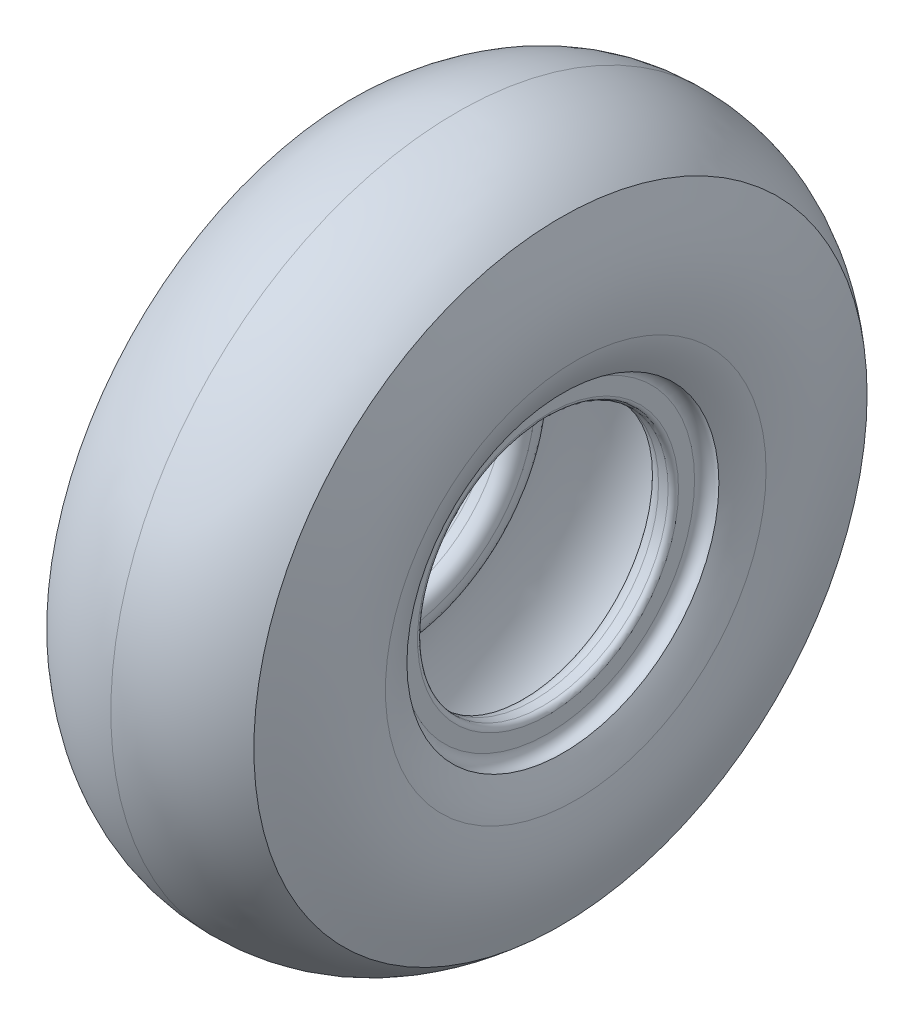
ISO-10303-21;
HEADER;
FILE_DESCRIPTION(('STEP AP214'),'2;1');
FILE_NAME('part.step','',(''),(''),'','','');
FILE_SCHEMA(('AUTOMOTIVE_DESIGN { 1 0 10303 214 1 1 1 1 }'));
ENDSEC;
DATA;
#1=APPLICATION_CONTEXT('core data for automotive mechanical design processes');
#2=APPLICATION_PROTOCOL_DEFINITION('international standard','automotive_design',2000,#1);
#3=PRODUCT_CONTEXT('',#1,'mechanical');
#4=PRODUCT('Part','Part','',(#3));
#5=PRODUCT_RELATED_PRODUCT_CATEGORY('part','',(#4));
#6=PRODUCT_DEFINITION_FORMATION('','',#4);
#7=PRODUCT_DEFINITION_CONTEXT('part definition',#1,'design');
#8=PRODUCT_DEFINITION('design','',#6,#7);
#9=PRODUCT_DEFINITION_SHAPE('','',#8);
#10=(LENGTH_UNIT() NAMED_UNIT(*) SI_UNIT(.MILLI.,.METRE.));
#11=(NAMED_UNIT(*) PLANE_ANGLE_UNIT() SI_UNIT($,.RADIAN.));
#12=(NAMED_UNIT(*) SI_UNIT($,.STERADIAN.) SOLID_ANGLE_UNIT());
#13=UNCERTAINTY_MEASURE_WITH_UNIT(LENGTH_MEASURE(1.E-05),#10,'distance_accuracy_value','');
#14=(GEOMETRIC_REPRESENTATION_CONTEXT(3) GLOBAL_UNCERTAINTY_ASSIGNED_CONTEXT((#13)) GLOBAL_UNIT_ASSIGNED_CONTEXT((#10,
#11,#12)) REPRESENTATION_CONTEXT('',''));
#15=CARTESIAN_POINT('',(0.,0.,0.));
#16=DIRECTION('',(0.,0.,1.));
#17=DIRECTION('',(1.,0.,0.));
#18=AXIS2_PLACEMENT_3D('',#15,#16,#17);
#19=CARTESIAN_POINT('',(-126.,373.,0.));
#20=CARTESIAN_POINT('',(-134.463972669788,346.616375838066,0.));
#21=CARTESIAN_POINT('',(-150.849086538786,300.261707780423,0.));
#22=CARTESIAN_POINT('',(-147.808915286661,251.408445959692,0.));
#23=CARTESIAN_POINT('',(-144.553912722823,231.528887517126,0.));
#24=B_SPLINE_CURVE_WITH_KNOTS('',3,(#19,#20,#21,#22,#23),.UNSPECIFIED.,.F.,.F.,(4,1,4),(0.,
0.58160163982579,1.),.UNSPECIFIED.);
#25=CARTESIAN_POINT('',(0.,0.,0.));
#26=DIRECTION('',(1.,0.,0.));
#27=AXIS1_PLACEMENT('',#25,#26);
#28=SURFACE_OF_REVOLUTION('',#24,#27);
#29=CARTESIAN_POINT('',(-144.553912722823,0.,0.));
#30=DIRECTION('',(1.,0.,0.));
#31=DIRECTION('',(0.,0.,-1.));
#32=AXIS2_PLACEMENT_3D('',#29,#30,#31);
#33=CIRCLE('',#32,231.528887517126);
#34=CARTESIAN_POINT('',(-144.553912722823,0.,-231.528887517126));
#35=VERTEX_POINT('',#34);
#36=EDGE_CURVE('E10',#35,#35,#33,.T.);
#37=ORIENTED_EDGE('',*,*,#36,.T.);
#38=EDGE_LOOP('',(#37));
#39=FACE_BOUND('',#38,.T.);
#40=CARTESIAN_POINT('',(-126.,0.,0.));
#41=DIRECTION('',(1.,0.,0.));
#42=DIRECTION('',(0.,0.,-1.));
#43=AXIS2_PLACEMENT_3D('',#40,#41,#42);
#44=CIRCLE('',#43,373.);
#45=CARTESIAN_POINT('',(-126.,0.,-373.));
#46=VERTEX_POINT('',#45);
#47=EDGE_CURVE('E95',#46,#46,#44,.T.);
#48=ORIENTED_EDGE('',*,*,#47,.F.);
#49=EDGE_LOOP('',(#48));
#50=FACE_BOUND('',#49,.T.);
#51=ADVANCED_FACE('F36',(#39,#50),#28,.F.);
#52=CARTESIAN_POINT('',(-144.553912722823,231.528887517126,0.));
#53=CARTESIAN_POINT('',(-142.116576841013,216.643135461223,0.));
#54=CARTESIAN_POINT('',(-135.993470909118,202.872182939122,0.));
#55=CARTESIAN_POINT('',(-128.926694684957,189.755700946259,0.));
#56=B_SPLINE_CURVE_WITH_KNOTS('',3,(#52,#53,#54,#55),.UNSPECIFIED.,.F.,.F.,(4,4),(0.,1.),.UNSPECIFIED.);
#57=CARTESIAN_POINT('',(0.,0.,0.));
#58=DIRECTION('',(1.,0.,0.));
#59=AXIS1_PLACEMENT('',#57,#58);
#60=SURFACE_OF_REVOLUTION('',#56,#59);
#61=CARTESIAN_POINT('',(-128.926694684957,0.,0.));
#62=DIRECTION('',(1.,0.,0.));
#63=DIRECTION('',(0.,0.,-1.));
#64=AXIS2_PLACEMENT_3D('',#61,#62,#63);
#65=CIRCLE('',#64,189.755700946259);
#66=CARTESIAN_POINT('',(-128.926694684957,0.,-189.755700946259));
#67=VERTEX_POINT('',#66);
#68=EDGE_CURVE('E43',#67,#67,#65,.T.);
#69=ORIENTED_EDGE('',*,*,#68,.T.);
#70=EDGE_LOOP('',(#69));
#71=FACE_BOUND('',#70,.T.);
#72=ORIENTED_EDGE('',*,*,#36,.F.);
#73=EDGE_LOOP('',(#72));
#74=FACE_BOUND('',#73,.T.);
#75=ADVANCED_FACE('F179',(#71,#74),#60,.F.);
#76=CARTESIAN_POINT('',(-123.55,0.,0.));
#77=DIRECTION('',(1.,0.,0.));
#78=DIRECTION('',(0.,0.,-1.));
#79=AXIS2_PLACEMENT_3D('',#76,#77,#78);
#80=TOROIDAL_SURFACE('',#79,178.25,12.7);
#81=CARTESIAN_POINT('',(-110.85,0.,0.));
#82=DIRECTION('',(1.,0.,0.));
#83=DIRECTION('',(0.,0.,-1.));
#84=AXIS2_PLACEMENT_3D('',#81,#82,#83);
#85=CIRCLE('',#84,178.25);
#86=CARTESIAN_POINT('',(-110.85,0.,-178.25));
#87=VERTEX_POINT('',#86);
#88=EDGE_CURVE('E47',#87,#87,#85,.T.);
#89=ORIENTED_EDGE('',*,*,#88,.T.);
#90=EDGE_LOOP('',(#89));
#91=FACE_BOUND('',#90,.T.);
#92=ORIENTED_EDGE('',*,*,#68,.F.);
#93=EDGE_LOOP('',(#92));
#94=FACE_BOUND('',#93,.T.);
#95=ADVANCED_FACE('F176',(#91,#94),#80,.F.);
#96=CARTESIAN_POINT('',(-110.85,178.25,0.));
#97=DIRECTION('',(-1.,0.,0.));
#98=DIRECTION('',(0.,0.,1.));
#99=AXIS2_PLACEMENT_3D('',#96,#97,#98);
#100=PLANE('',#99);
#101=CARTESIAN_POINT('',(-110.85,0.,0.));
#102=DIRECTION('',(1.,0.,0.));
#103=DIRECTION('',(0.,0.,-1.));
#104=AXIS2_PLACEMENT_3D('',#101,#102,#103);
#105=CIRCLE('',#104,158.75);
#106=CARTESIAN_POINT('',(-110.85,0.,-158.75));
#107=VERTEX_POINT('',#106);
#108=EDGE_CURVE('E51',#107,#107,#105,.T.);
#109=ORIENTED_EDGE('',*,*,#108,.T.);
#110=EDGE_LOOP('',(#109));
#111=FACE_BOUND('',#110,.T.);
#112=ORIENTED_EDGE('',*,*,#88,.F.);
#113=EDGE_LOOP('',(#112));
#114=FACE_BOUND('',#113,.T.);
#115=ADVANCED_FACE('F172',(#111,#114),#100,.T.);
#116=CARTESIAN_POINT('',(-104.5,0.,0.));
#117=DIRECTION('',(1.,0.,0.));
#118=DIRECTION('',(0.,0.,-1.));
#119=AXIS2_PLACEMENT_3D('',#116,#117,#118);
#120=TOROIDAL_SURFACE('',#119,158.75,6.35000000000001);
#121=CARTESIAN_POINT('',(-104.5,0.,0.));
#122=DIRECTION('',(1.,0.,0.));
#123=DIRECTION('',(0.,0.,-1.));
#124=AXIS2_PLACEMENT_3D('',#121,#122,#123);
#125=CIRCLE('',#124,152.4);
#126=CARTESIAN_POINT('',(-104.5,0.,-152.4));
#127=VERTEX_POINT('',#126);
#128=EDGE_CURVE('E56',#127,#127,#125,.T.);
#129=ORIENTED_EDGE('',*,*,#128,.T.);
#130=EDGE_LOOP('',(#129));
#131=FACE_BOUND('',#130,.T.);
#132=ORIENTED_EDGE('',*,*,#108,.F.);
#133=EDGE_LOOP('',(#132));
#134=FACE_BOUND('',#133,.T.);
#135=ADVANCED_FACE('F168',(#131,#134),#120,.T.);
#136=CARTESIAN_POINT('',(0.,0.,0.));
#137=DIRECTION('',(1.,0.,0.));
#138=DIRECTION('',(0.,0.,-1.));
#139=AXIS2_PLACEMENT_3D('',#136,#137,#138);
#140=CYLINDRICAL_SURFACE('',#139,152.4);
#141=CARTESIAN_POINT('',(-92.923559226577,0.,0.));
#142=DIRECTION('',(1.,0.,0.));
#143=DIRECTION('',(0.,0.,-1.));
#144=AXIS2_PLACEMENT_3D('',#141,#142,#143);
#145=CIRCLE('',#144,152.4);
#146=CARTESIAN_POINT('',(-92.923559226577,0.,-152.4));
#147=VERTEX_POINT('',#146);
#148=EDGE_CURVE('E59',#147,#147,#145,.T.);
#149=ORIENTED_EDGE('',*,*,#148,.T.);
#150=EDGE_LOOP('',(#149));
#151=FACE_BOUND('',#150,.T.);
#152=ORIENTED_EDGE('',*,*,#128,.F.);
#153=EDGE_LOOP('',(#152));
#154=FACE_BOUND('',#153,.T.);
#155=ADVANCED_FACE('F164',(#151,#154),#140,.F.);
#156=CARTESIAN_POINT('',(-92.923559226577,0.,0.));
#157=DIRECTION('',(1.,0.,0.));
#158=DIRECTION('',(0.,0.,-1.));
#159=AXIS2_PLACEMENT_3D('',#156,#157,#158);
#160=TOROIDAL_SURFACE('',#159,170.326440773423,17.926440773423);
#161=CARTESIAN_POINT('',(-74.997118453154,0.,0.));
#162=DIRECTION('',(1.,0.,0.));
#163=DIRECTION('',(0.,0.,-1.));
#164=AXIS2_PLACEMENT_3D('',#161,#162,#163);
#165=CIRCLE('',#164,170.326440773423);
#166=CARTESIAN_POINT('',(-74.997118453154,0.,-170.326440773423));
#167=VERTEX_POINT('',#166);
#168=EDGE_CURVE('E62',#167,#167,#165,.T.);
#169=ORIENTED_EDGE('',*,*,#168,.T.);
#170=EDGE_LOOP('',(#169));
#171=FACE_BOUND('',#170,.T.);
#172=ORIENTED_EDGE('',*,*,#148,.F.);
#173=EDGE_LOOP('',(#172));
#174=FACE_BOUND('',#173,.T.);
#175=ADVANCED_FACE('F160',(#171,#174),#160,.T.);
#176=CARTESIAN_POINT('',(-74.997118453154,170.326440773423,0.));
#177=CARTESIAN_POINT('',(-74.997118453154,174.893056842313,0.));
#178=CARTESIAN_POINT('',(-75.863137268503,181.894012855497,0.));
#179=CARTESIAN_POINT('',(-82.0328584332981,193.460925903573,0.));
#180=CARTESIAN_POINT('',(-101.647275090504,203.726943462766,0.));
#181=CARTESIAN_POINT('',(-122.603513674661,219.701955533841,0.));
#182=CARTESIAN_POINT('',(-131.843827251993,247.310555364488,0.));
#183=CARTESIAN_POINT('',(-129.946687913005,281.889706084341,0.));
#184=CARTESIAN_POINT('',(-120.331163887066,324.533954003855,0.));
#185=CARTESIAN_POINT('',(-87.243017221231,382.698494330337,0.));
#186=CARTESIAN_POINT('',(-32.66406747827,399.596434141247,0.));
#187=CARTESIAN_POINT('',(0.,401.816012960345,0.));
#188=B_SPLINE_CURVE_WITH_KNOTS('',3,(#176,#177,#178,#179,#180,#181,#182,#183,#184,#185,#186,
#187),.UNSPECIFIED.,.F.,.F.,(4,1,1,1,1,1,1,1,1,4),(0.,0.0343147975041617,0.0496711709441499,
0.153563734399882,0.219661882438087,0.288453449245857,0.408499806443025,0.534394681443801,
0.688488778095142,1.),.UNSPECIFIED.);
#189=CARTESIAN_POINT('',(0.,0.,0.));
#190=DIRECTION('',(1.,0.,0.));
#191=AXIS1_PLACEMENT('',#189,#190);
#192=SURFACE_OF_REVOLUTION('',#188,#191);
#193=CARTESIAN_POINT('',(0.,0.,0.));
#194=DIRECTION('',(1.,0.,0.));
#195=DIRECTION('',(0.,0.,-1.));
#196=AXIS2_PLACEMENT_3D('',#193,#194,#195);
#197=CIRCLE('',#196,401.816012960345);
#198=CARTESIAN_POINT('',(0.,0.,-401.816012960345));
#199=VERTEX_POINT('',#198);
#200=EDGE_CURVE('E65',#199,#199,#197,.T.);
#201=ORIENTED_EDGE('',*,*,#200,.T.);
#202=EDGE_LOOP('',(#201));
#203=FACE_BOUND('',#202,.T.);
#204=ORIENTED_EDGE('',*,*,#168,.F.);
#205=EDGE_LOOP('',(#204));
#206=FACE_BOUND('',#205,.T.);
#207=ADVANCED_FACE('F155',(#203,#206),#192,.F.);
#208=CARTESIAN_POINT('',(0.,401.816012960345,0.));
#209=CARTESIAN_POINT('',(32.66406747827,399.596434141247,0.));
#210=CARTESIAN_POINT('',(87.243017221231,382.698494330337,0.));
#211=CARTESIAN_POINT('',(120.331163887066,324.533954003855,0.));
#212=CARTESIAN_POINT('',(129.946687913005,281.889706084341,0.));
#213=CARTESIAN_POINT('',(131.843827251993,247.310555364488,0.));
#214=CARTESIAN_POINT('',(122.603513674661,219.701955533841,0.));
#215=CARTESIAN_POINT('',(101.647275090504,203.726943462766,0.));
#216=CARTESIAN_POINT('',(82.0328584332981,193.460925903573,0.));
#217=CARTESIAN_POINT('',(75.863137268503,181.894012855497,0.));
#218=CARTESIAN_POINT('',(74.997118453154,174.893056842313,0.));
#219=CARTESIAN_POINT('',(74.997118453154,170.326440773423,0.));
#220=B_SPLINE_CURVE_WITH_KNOTS('',3,(#208,#209,#210,#211,#212,#213,#214,#215,#216,#217,#218,
#219),.UNSPECIFIED.,.F.,.F.,(4,1,1,1,1,1,1,1,1,4),(0.,0.311511221904858,0.465605318556199,
0.591500193556975,0.711546550754143,0.780338117561913,0.846436265600118,0.95032882905585,
0.965685202495838,1.),.UNSPECIFIED.);
#221=CARTESIAN_POINT('',(0.,0.,0.));
#222=DIRECTION('',(1.,0.,0.));
#223=AXIS1_PLACEMENT('',#221,#222);
#224=SURFACE_OF_REVOLUTION('',#220,#223);
#225=CARTESIAN_POINT('',(74.997118453154,0.,0.));
#226=DIRECTION('',(1.,0.,0.));
#227=DIRECTION('',(0.,0.,-1.));
#228=AXIS2_PLACEMENT_3D('',#225,#226,#227);
#229=CIRCLE('',#228,170.326440773423);
#230=CARTESIAN_POINT('',(74.997118453154,0.,-170.326440773423));
#231=VERTEX_POINT('',#230);
#232=EDGE_CURVE('E68',#231,#231,#229,.T.);
#233=ORIENTED_EDGE('',*,*,#232,.T.);
#234=EDGE_LOOP('',(#233));
#235=FACE_BOUND('',#234,.T.);
#236=ORIENTED_EDGE('',*,*,#200,.F.);
#237=EDGE_LOOP('',(#236));
#238=FACE_BOUND('',#237,.T.);
#239=ADVANCED_FACE('F150',(#235,#238),#224,.F.);
#240=CARTESIAN_POINT('',(92.923559226577,0.,0.));
#241=DIRECTION('',(1.,0.,0.));
#242=DIRECTION('',(0.,0.,-1.));
#243=AXIS2_PLACEMENT_3D('',#240,#241,#242);
#244=TOROIDAL_SURFACE('',#243,170.326440773423,17.926440773423);
#245=CARTESIAN_POINT('',(92.923559226577,0.,0.));
#246=DIRECTION('',(1.,0.,0.));
#247=DIRECTION('',(0.,0.,-1.));
#248=AXIS2_PLACEMENT_3D('',#245,#246,#247);
#249=CIRCLE('',#248,152.4);
#250=CARTESIAN_POINT('',(92.923559226577,0.,-152.4));
#251=VERTEX_POINT('',#250);
#252=EDGE_CURVE('E71',#251,#251,#249,.T.);
#253=ORIENTED_EDGE('',*,*,#252,.T.);
#254=EDGE_LOOP('',(#253));
#255=FACE_BOUND('',#254,.T.);
#256=ORIENTED_EDGE('',*,*,#232,.F.);
#257=EDGE_LOOP('',(#256));
#258=FACE_BOUND('',#257,.T.);
#259=ADVANCED_FACE('F154',(#255,#258),#244,.T.);
#260=CARTESIAN_POINT('',(0.,0.,0.));
#261=DIRECTION('',(1.,0.,0.));
#262=DIRECTION('',(0.,0.,-1.));
#263=AXIS2_PLACEMENT_3D('',#260,#261,#262);
#264=CYLINDRICAL_SURFACE('',#263,152.4);
#265=CARTESIAN_POINT('',(104.5,0.,0.));
#266=DIRECTION('',(1.,0.,0.));
#267=DIRECTION('',(0.,0.,-1.));
#268=AXIS2_PLACEMENT_3D('',#265,#266,#267);
#269=CIRCLE('',#268,152.4);
#270=CARTESIAN_POINT('',(104.5,0.,-152.4));
#271=VERTEX_POINT('',#270);
#272=EDGE_CURVE('E74',#271,#271,#269,.T.);
#273=ORIENTED_EDGE('',*,*,#272,.T.);
#274=EDGE_LOOP('',(#273));
#275=FACE_BOUND('',#274,.T.);
#276=ORIENTED_EDGE('',*,*,#252,.F.);
#277=EDGE_LOOP('',(#276));
#278=FACE_BOUND('',#277,.T.);
#279=ADVANCED_FACE('F227',(#275,#278),#264,.F.);
#280=CARTESIAN_POINT('',(104.5,0.,0.));
#281=DIRECTION('',(1.,0.,0.));
#282=DIRECTION('',(0.,0.,-1.));
#283=AXIS2_PLACEMENT_3D('',#280,#281,#282);
#284=TOROIDAL_SURFACE('',#283,158.75,6.35000000000001);
#285=CARTESIAN_POINT('',(110.85,0.,0.));
#286=DIRECTION('',(1.,0.,0.));
#287=DIRECTION('',(0.,0.,-1.));
#288=AXIS2_PLACEMENT_3D('',#285,#286,#287);
#289=CIRCLE('',#288,158.75);
#290=CARTESIAN_POINT('',(110.85,0.,-158.75));
#291=VERTEX_POINT('',#290);
#292=EDGE_CURVE('E77',#291,#291,#289,.T.);
#293=ORIENTED_EDGE('',*,*,#292,.T.);
#294=EDGE_LOOP('',(#293));
#295=FACE_BOUND('',#294,.T.);
#296=ORIENTED_EDGE('',*,*,#272,.F.);
#297=EDGE_LOOP('',(#296));
#298=FACE_BOUND('',#297,.T.);
#299=ADVANCED_FACE('F221',(#295,#298),#284,.T.);
#300=CARTESIAN_POINT('',(110.85,178.25,0.));
#301=DIRECTION('',(1.,0.,0.));
#302=DIRECTION('',(0.,0.,-1.));
#303=AXIS2_PLACEMENT_3D('',#300,#301,#302);
#304=PLANE('',#303);
#305=CARTESIAN_POINT('',(110.85,0.,0.));
#306=DIRECTION('',(1.,0.,0.));
#307=DIRECTION('',(0.,0.,-1.));
#308=AXIS2_PLACEMENT_3D('',#305,#306,#307);
#309=CIRCLE('',#308,178.25);
#310=CARTESIAN_POINT('',(110.85,0.,-178.25));
#311=VERTEX_POINT('',#310);
#312=EDGE_CURVE('E80',#311,#311,#309,.T.);
#313=ORIENTED_EDGE('',*,*,#312,.T.);
#314=EDGE_LOOP('',(#313));
#315=FACE_BOUND('',#314,.T.);
#316=ORIENTED_EDGE('',*,*,#292,.F.);
#317=EDGE_LOOP('',(#316));
#318=FACE_BOUND('',#317,.T.);
#319=ADVANCED_FACE('F216',(#315,#318),#304,.T.);
#320=CARTESIAN_POINT('',(123.55,0.,0.));
#321=DIRECTION('',(1.,0.,0.));
#322=DIRECTION('',(0.,0.,-1.));
#323=AXIS2_PLACEMENT_3D('',#320,#321,#322);
#324=TOROIDAL_SURFACE('',#323,178.25,12.7);
#325=CARTESIAN_POINT('',(128.926694684957,0.,0.));
#326=DIRECTION('',(1.,0.,0.));
#327=DIRECTION('',(0.,0.,-1.));
#328=AXIS2_PLACEMENT_3D('',#325,#326,#327);
#329=CIRCLE('',#328,189.755700946259);
#330=CARTESIAN_POINT('',(128.926694684957,0.,-189.755700946259));
#331=VERTEX_POINT('',#330);
#332=EDGE_CURVE('E83',#331,#331,#329,.T.);
#333=ORIENTED_EDGE('',*,*,#332,.T.);
#334=EDGE_LOOP('',(#333));
#335=FACE_BOUND('',#334,.T.);
#336=ORIENTED_EDGE('',*,*,#312,.F.);
#337=EDGE_LOOP('',(#336));
#338=FACE_BOUND('',#337,.T.);
#339=ADVANCED_FACE('F211',(#335,#338),#324,.F.);
#340=CARTESIAN_POINT('',(128.926694684957,189.755700946259,0.));
#341=CARTESIAN_POINT('',(135.993470909118,202.872182939122,0.));
#342=CARTESIAN_POINT('',(142.116576841013,216.643135461223,0.));
#343=CARTESIAN_POINT('',(144.553912722823,231.528887517126,0.));
#344=B_SPLINE_CURVE_WITH_KNOTS('',3,(#340,#341,#342,#343),.UNSPECIFIED.,.F.,.F.,(4,4),(0.,1.),.UNSPECIFIED.);
#345=CARTESIAN_POINT('',(0.,0.,0.));
#346=DIRECTION('',(1.,0.,0.));
#347=AXIS1_PLACEMENT('',#345,#346);
#348=SURFACE_OF_REVOLUTION('',#344,#347);
#349=CARTESIAN_POINT('',(144.553912722823,0.,0.));
#350=DIRECTION('',(1.,0.,0.));
#351=DIRECTION('',(0.,0.,-1.));
#352=AXIS2_PLACEMENT_3D('',#349,#350,#351);
#353=CIRCLE('',#352,231.528887517126);
#354=CARTESIAN_POINT('',(144.553912722823,0.,-231.528887517126));
#355=VERTEX_POINT('',#354);
#356=EDGE_CURVE('E86',#355,#355,#353,.T.);
#357=ORIENTED_EDGE('',*,*,#356,.T.);
#358=EDGE_LOOP('',(#357));
#359=FACE_BOUND('',#358,.T.);
#360=ORIENTED_EDGE('',*,*,#332,.F.);
#361=EDGE_LOOP('',(#360));
#362=FACE_BOUND('',#361,.T.);
#363=ADVANCED_FACE('F121',(#359,#362),#348,.F.);
#364=CARTESIAN_POINT('',(144.553912722823,231.528887517126,0.));
#365=CARTESIAN_POINT('',(147.808915286661,251.408445959692,0.));
#366=CARTESIAN_POINT('',(150.849086538786,300.261707780423,0.));
#367=CARTESIAN_POINT('',(134.463972669788,346.616375838066,0.));
#368=CARTESIAN_POINT('',(126.,373.,0.));
#369=B_SPLINE_CURVE_WITH_KNOTS('',3,(#364,#365,#366,#367,#368),.UNSPECIFIED.,.F.,.F.,(4,1,4),
(0.,0.41839836017421,1.),.UNSPECIFIED.);
#370=CARTESIAN_POINT('',(0.,0.,0.));
#371=DIRECTION('',(1.,0.,0.));
#372=AXIS1_PLACEMENT('',#370,#371);
#373=SURFACE_OF_REVOLUTION('',#369,#372);
#374=CARTESIAN_POINT('',(126.,0.,0.));
#375=DIRECTION('',(1.,0.,0.));
#376=DIRECTION('',(0.,0.,-1.));
#377=AXIS2_PLACEMENT_3D('',#374,#375,#376);
#378=CIRCLE('',#377,373.);
#379=CARTESIAN_POINT('',(126.,0.,-373.));
#380=VERTEX_POINT('',#379);
#381=EDGE_CURVE('E89',#380,#380,#378,.T.);
#382=ORIENTED_EDGE('',*,*,#381,.T.);
#383=EDGE_LOOP('',(#382));
#384=FACE_BOUND('',#383,.T.);
#385=ORIENTED_EDGE('',*,*,#356,.F.);
#386=EDGE_LOOP('',(#385));
#387=FACE_BOUND('',#386,.T.);
#388=ADVANCED_FACE('F117',(#384,#387),#373,.F.);
#389=CARTESIAN_POINT('',(126.,373.,0.));
#390=CARTESIAN_POINT('',(71.226771367212,421.000000000001,0.));
#391=CARTESIAN_POINT('',(0.,421.,0.));
#392=B_SPLINE_CURVE_WITH_KNOTS('',2,(#389,#390,#391),.UNSPECIFIED.,.F.,.F.,(3,3),(0.,1.),.UNSPECIFIED.);
#393=CARTESIAN_POINT('',(0.,0.,0.));
#394=DIRECTION('',(1.,0.,0.));
#395=AXIS1_PLACEMENT('',#393,#394);
#396=SURFACE_OF_REVOLUTION('',#392,#395);
#397=CARTESIAN_POINT('',(0.,0.,0.));
#398=DIRECTION('',(1.,0.,0.));
#399=DIRECTION('',(0.,0.,-1.));
#400=AXIS2_PLACEMENT_3D('',#397,#398,#399);
#401=CIRCLE('',#400,421.);
#402=CARTESIAN_POINT('',(0.,0.,-421.));
#403=VERTEX_POINT('',#402);
#404=EDGE_CURVE('E92',#403,#403,#401,.T.);
#405=ORIENTED_EDGE('',*,*,#404,.T.);
#406=EDGE_LOOP('',(#405));
#407=FACE_BOUND('',#406,.T.);
#408=ORIENTED_EDGE('',*,*,#381,.F.);
#409=EDGE_LOOP('',(#408));
#410=FACE_BOUND('',#409,.T.);
#411=ADVANCED_FACE('F113',(#407,#410),#396,.F.);
#412=CARTESIAN_POINT('',(0.,421.,0.));
#413=CARTESIAN_POINT('',(-71.226771367212,421.000000000001,0.));
#414=CARTESIAN_POINT('',(-126.,373.,0.));
#415=B_SPLINE_CURVE_WITH_KNOTS('',2,(#412,#413,#414),.UNSPECIFIED.,.F.,.F.,(3,3),(0.,1.),.UNSPECIFIED.);
#416=CARTESIAN_POINT('',(0.,0.,0.));
#417=DIRECTION('',(1.,0.,0.));
#418=AXIS1_PLACEMENT('',#416,#417);
#419=SURFACE_OF_REVOLUTION('',#415,#418);
#420=ORIENTED_EDGE('',*,*,#47,.T.);
#421=EDGE_LOOP('',(#420));
#422=FACE_BOUND('',#421,.T.);
#423=ORIENTED_EDGE('',*,*,#404,.F.);
#424=EDGE_LOOP('',(#423));
#425=FACE_BOUND('',#424,.T.);
#426=ADVANCED_FACE('F110',(#422,#425),#419,.F.);
#427=CLOSED_SHELL('',(#51,#75,#95,#115,#135,#155,#175,#207,#239,#259,#279,#299,#319,#339,#363,
#388,#411,#426));
#428=MANIFOLD_SOLID_BREP('B2',#427);
#429=ADVANCED_BREP_SHAPE_REPRESENTATION('',(#18,#428),#14);
#430=SHAPE_DEFINITION_REPRESENTATION(#9,#429);
ENDSEC;
END-ISO-10303-21;
